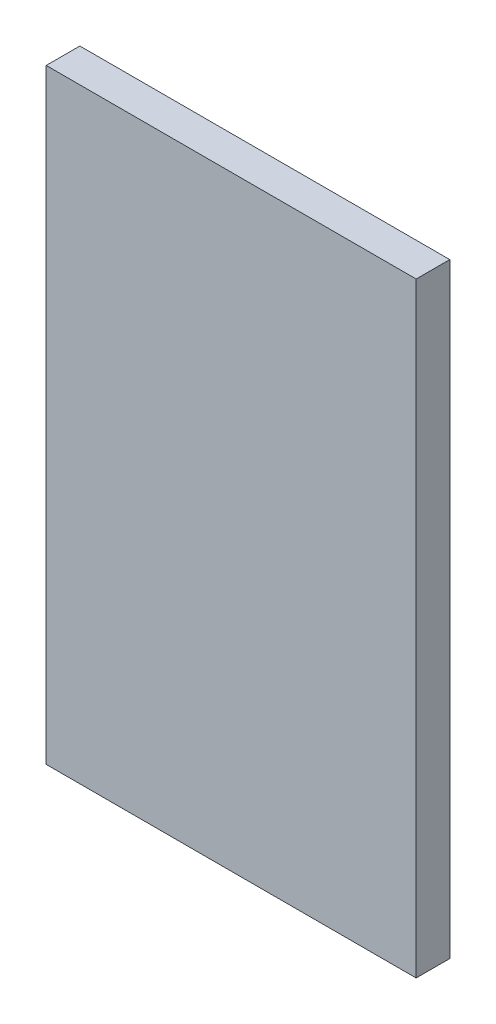
ISO-10303-21;
HEADER;
FILE_DESCRIPTION(('STEP AP214'),'2;1');
FILE_NAME('part.step','',(''),(''),'','','');
FILE_SCHEMA(('AUTOMOTIVE_DESIGN { 1 0 10303 214 1 1 1 1 }'));
ENDSEC;
DATA;
#1=APPLICATION_CONTEXT('core data for automotive mechanical design processes');
#2=APPLICATION_PROTOCOL_DEFINITION('international standard','automotive_design',2000,#1);
#3=PRODUCT_CONTEXT('',#1,'mechanical');
#4=PRODUCT('Part','Part','',(#3));
#5=PRODUCT_RELATED_PRODUCT_CATEGORY('part','',(#4));
#6=PRODUCT_DEFINITION_FORMATION('','',#4);
#7=PRODUCT_DEFINITION_CONTEXT('part definition',#1,'design');
#8=PRODUCT_DEFINITION('design','',#6,#7);
#9=PRODUCT_DEFINITION_SHAPE('','',#8);
#10=(LENGTH_UNIT() NAMED_UNIT(*) SI_UNIT(.MILLI.,.METRE.));
#11=(NAMED_UNIT(*) PLANE_ANGLE_UNIT() SI_UNIT($,.RADIAN.));
#12=(NAMED_UNIT(*) SI_UNIT($,.STERADIAN.) SOLID_ANGLE_UNIT());
#13=UNCERTAINTY_MEASURE_WITH_UNIT(LENGTH_MEASURE(1.E-05),#10,'distance_accuracy_value','');
#14=(GEOMETRIC_REPRESENTATION_CONTEXT(3) GLOBAL_UNCERTAINTY_ASSIGNED_CONTEXT((#13)) GLOBAL_UNIT_ASSIGNED_CONTEXT((#10,
#11,#12)) REPRESENTATION_CONTEXT('',''));
#15=CARTESIAN_POINT('',(0.,0.,0.));
#16=DIRECTION('',(0.,0.,1.));
#17=DIRECTION('',(1.,0.,0.));
#18=AXIS2_PLACEMENT_3D('',#15,#16,#17);
#19=CARTESIAN_POINT('',(0.,0.,50.));
#20=DIRECTION('',(1.,0.,0.));
#21=DIRECTION('',(0.,0.,-1.));
#22=AXIS2_PLACEMENT_3D('',#19,#20,#21);
#23=PLANE('',#22);
#24=DIRECTION('',(0.,-1.,0.));
#25=VECTOR('',#24,1.);
#26=CARTESIAN_POINT('',(0.,0.,0.));
#27=LINE('',#26,#25);
#28=CARTESIAN_POINT('',(0.,900.,0.));
#29=VERTEX_POINT('',#28);
#30=CARTESIAN_POINT('',(0.,0.,0.));
#31=VERTEX_POINT('',#30);
#32=EDGE_CURVE('E98',#29,#31,#27,.T.);
#33=ORIENTED_EDGE('',*,*,#32,.T.);
#34=DIRECTION('',(0.,0.,-1.));
#35=VECTOR('',#34,1.);
#36=CARTESIAN_POINT('',(0.,0.,50.));
#37=LINE('',#36,#35);
#38=CARTESIAN_POINT('',(0.,0.,50.));
#39=VERTEX_POINT('',#38);
#40=EDGE_CURVE('E11',#39,#31,#37,.T.);
#41=ORIENTED_EDGE('',*,*,#40,.F.);
#42=DIRECTION('',(0.,-1.,0.));
#43=VECTOR('',#42,1.);
#44=CARTESIAN_POINT('',(0.,0.,50.));
#45=LINE('',#44,#43);
#46=CARTESIAN_POINT('',(0.,900.,50.));
#47=VERTEX_POINT('',#46);
#48=EDGE_CURVE('E86',#47,#39,#45,.T.);
#49=ORIENTED_EDGE('',*,*,#48,.F.);
#50=DIRECTION('',(0.,0.,-1.));
#51=VECTOR('',#50,1.);
#52=CARTESIAN_POINT('',(0.,900.,50.));
#53=LINE('',#52,#51);
#54=EDGE_CURVE('E94',#47,#29,#53,.T.);
#55=ORIENTED_EDGE('',*,*,#54,.T.);
#56=EDGE_LOOP('',(#33,#41,#49,#55));
#57=FACE_BOUND('',#56,.T.);
#58=ADVANCED_FACE('F35',(#57),#23,.F.);
#59=CARTESIAN_POINT('',(0.,0.,50.));
#60=DIRECTION('',(0.,1.,0.));
#61=DIRECTION('',(0.,0.,1.));
#62=AXIS2_PLACEMENT_3D('',#59,#60,#61);
#63=PLANE('',#62);
#64=DIRECTION('',(1.,0.,0.));
#65=VECTOR('',#64,1.);
#66=CARTESIAN_POINT('',(0.,0.,0.));
#67=LINE('',#66,#65);
#68=CARTESIAN_POINT('',(550.,0.,0.));
#69=VERTEX_POINT('',#68);
#70=EDGE_CURVE('E90',#31,#69,#67,.T.);
#71=ORIENTED_EDGE('',*,*,#70,.T.);
#72=DIRECTION('',(0.,0.,-1.));
#73=VECTOR('',#72,1.);
#74=CARTESIAN_POINT('',(550.,0.,50.));
#75=LINE('',#74,#73);
#76=CARTESIAN_POINT('',(550.,0.,50.));
#77=VERTEX_POINT('',#76);
#78=EDGE_CURVE('E43',#77,#69,#75,.T.);
#79=ORIENTED_EDGE('',*,*,#78,.F.);
#80=DIRECTION('',(1.,0.,0.));
#81=VECTOR('',#80,1.);
#82=CARTESIAN_POINT('',(0.,0.,50.));
#83=LINE('',#82,#81);
#84=EDGE_CURVE('E81',#39,#77,#83,.T.);
#85=ORIENTED_EDGE('',*,*,#84,.F.);
#86=ORIENTED_EDGE('',*,*,#40,.T.);
#87=EDGE_LOOP('',(#71,#79,#85,#86));
#88=FACE_BOUND('',#87,.T.);
#89=ADVANCED_FACE('F89',(#88),#63,.F.);
#90=CARTESIAN_POINT('',(550.,0.,50.));
#91=DIRECTION('',(-1.,0.,0.));
#92=DIRECTION('',(0.,0.,1.));
#93=AXIS2_PLACEMENT_3D('',#90,#91,#92);
#94=PLANE('',#93);
#95=DIRECTION('',(0.,1.,0.));
#96=VECTOR('',#95,1.);
#97=CARTESIAN_POINT('',(550.,0.,0.));
#98=LINE('',#97,#96);
#99=CARTESIAN_POINT('',(550.,900.,0.));
#100=VERTEX_POINT('',#99);
#101=EDGE_CURVE('E68',#69,#100,#98,.T.);
#102=ORIENTED_EDGE('',*,*,#101,.T.);
#103=DIRECTION('',(0.,0.,-1.));
#104=VECTOR('',#103,1.);
#105=CARTESIAN_POINT('',(550.,900.,50.));
#106=LINE('',#105,#104);
#107=CARTESIAN_POINT('',(550.,900.,50.));
#108=VERTEX_POINT('',#107);
#109=EDGE_CURVE('E91',#108,#100,#106,.T.);
#110=ORIENTED_EDGE('',*,*,#109,.F.);
#111=DIRECTION('',(0.,1.,0.));
#112=VECTOR('',#111,1.);
#113=CARTESIAN_POINT('',(550.,0.,50.));
#114=LINE('',#113,#112);
#115=EDGE_CURVE('E84',#77,#108,#114,.T.);
#116=ORIENTED_EDGE('',*,*,#115,.F.);
#117=ORIENTED_EDGE('',*,*,#78,.T.);
#118=EDGE_LOOP('',(#102,#110,#116,#117));
#119=FACE_BOUND('',#118,.T.);
#120=ADVANCED_FACE('F92',(#119),#94,.F.);
#121=CARTESIAN_POINT('',(0.,900.,50.));
#122=DIRECTION('',(0.,-1.,0.));
#123=DIRECTION('',(0.,0.,-1.));
#124=AXIS2_PLACEMENT_3D('',#121,#122,#123);
#125=PLANE('',#124);
#126=DIRECTION('',(-1.,0.,0.));
#127=VECTOR('',#126,1.);
#128=CARTESIAN_POINT('',(0.,900.,0.));
#129=LINE('',#128,#127);
#130=EDGE_CURVE('E74',#100,#29,#129,.T.);
#131=ORIENTED_EDGE('',*,*,#130,.T.);
#132=ORIENTED_EDGE('',*,*,#54,.F.);
#133=DIRECTION('',(-1.,0.,0.));
#134=VECTOR('',#133,1.);
#135=CARTESIAN_POINT('',(0.,900.,50.));
#136=LINE('',#135,#134);
#137=EDGE_CURVE('E51',#108,#47,#136,.T.);
#138=ORIENTED_EDGE('',*,*,#137,.F.);
#139=ORIENTED_EDGE('',*,*,#109,.T.);
#140=EDGE_LOOP('',(#131,#132,#138,#139));
#141=FACE_BOUND('',#140,.T.);
#142=ADVANCED_FACE('F105',(#141),#125,.F.);
#143=CARTESIAN_POINT('',(0.,0.,50.));
#144=DIRECTION('',(0.,0.,-1.));
#145=DIRECTION('',(-1.,0.,0.));
#146=AXIS2_PLACEMENT_3D('',#143,#144,#145);
#147=PLANE('',#146);
#148=ORIENTED_EDGE('',*,*,#48,.T.);
#149=ORIENTED_EDGE('',*,*,#84,.T.);
#150=ORIENTED_EDGE('',*,*,#115,.T.);
#151=ORIENTED_EDGE('',*,*,#137,.T.);
#152=EDGE_LOOP('',(#148,#149,#150,#151));
#153=FACE_BOUND('',#152,.T.);
#154=ADVANCED_FACE('F82',(#153),#147,.F.);
#155=CARTESIAN_POINT('',(0.,0.,0.));
#156=DIRECTION('',(0.,0.,-1.));
#157=DIRECTION('',(-1.,0.,0.));
#158=AXIS2_PLACEMENT_3D('',#155,#156,#157);
#159=PLANE('',#158);
#160=ORIENTED_EDGE('',*,*,#32,.F.);
#161=ORIENTED_EDGE('',*,*,#130,.F.);
#162=ORIENTED_EDGE('',*,*,#101,.F.);
#163=ORIENTED_EDGE('',*,*,#70,.F.);
#164=EDGE_LOOP('',(#160,#161,#162,#163));
#165=FACE_BOUND('',#164,.T.);
#166=ADVANCED_FACE('F108',(#165),#159,.T.);
#167=CLOSED_SHELL('',(#58,#89,#120,#142,#154,#166));
#168=MANIFOLD_SOLID_BREP('B2',#167);
#169=ADVANCED_BREP_SHAPE_REPRESENTATION('',(#18,#168),#14);
#170=SHAPE_DEFINITION_REPRESENTATION(#9,#169);
ENDSEC;
END-ISO-10303-21;
